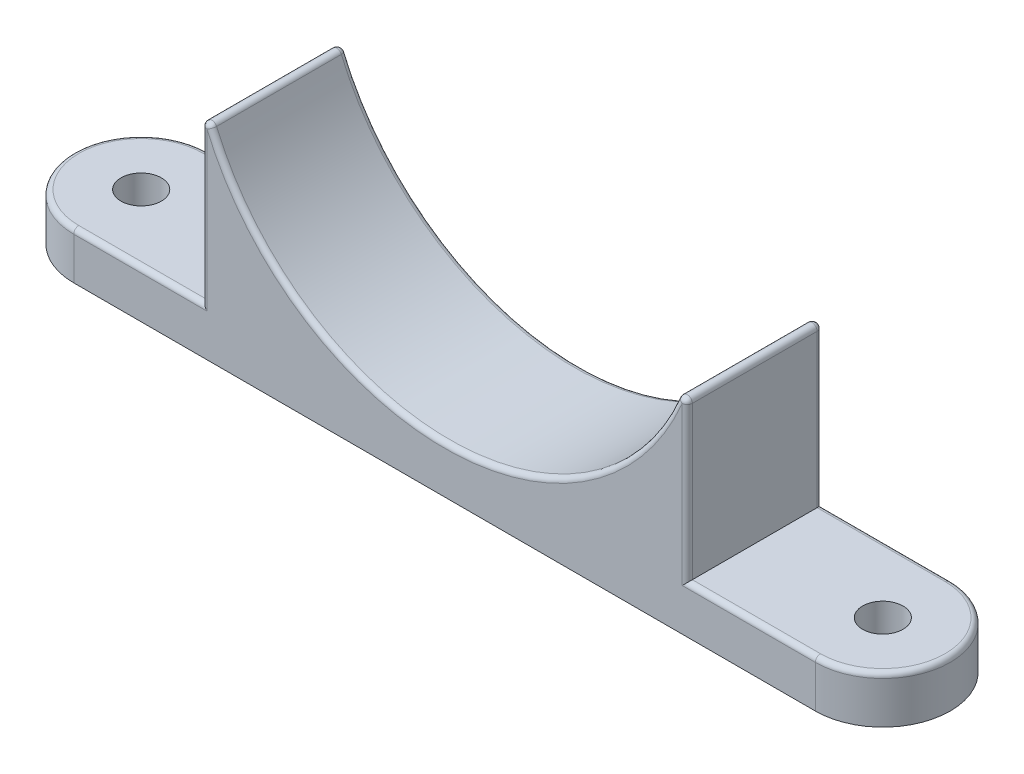
ISO-10303-21;
HEADER;
FILE_DESCRIPTION(('STEP AP214'),'2;1');
FILE_NAME('part.step','',(''),(''),'','','');
FILE_SCHEMA(('AUTOMOTIVE_DESIGN { 1 0 10303 214 1 1 1 1 }'));
ENDSEC;
DATA;
#1=APPLICATION_CONTEXT('core data for automotive mechanical design processes');
#2=APPLICATION_PROTOCOL_DEFINITION('international standard','automotive_design',2000,#1);
#3=PRODUCT_CONTEXT('',#1,'mechanical');
#4=PRODUCT('Part','Part','',(#3));
#5=PRODUCT_RELATED_PRODUCT_CATEGORY('part','',(#4));
#6=PRODUCT_DEFINITION_FORMATION('','',#4);
#7=PRODUCT_DEFINITION_CONTEXT('part definition',#1,'design');
#8=PRODUCT_DEFINITION('design','',#6,#7);
#9=PRODUCT_DEFINITION_SHAPE('','',#8);
#10=(LENGTH_UNIT() NAMED_UNIT(*) SI_UNIT(.MILLI.,.METRE.));
#11=(NAMED_UNIT(*) PLANE_ANGLE_UNIT() SI_UNIT($,.RADIAN.));
#12=(NAMED_UNIT(*) SI_UNIT($,.STERADIAN.) SOLID_ANGLE_UNIT());
#13=UNCERTAINTY_MEASURE_WITH_UNIT(LENGTH_MEASURE(1.E-05),#10,'distance_accuracy_value','');
#14=(GEOMETRIC_REPRESENTATION_CONTEXT(3) GLOBAL_UNCERTAINTY_ASSIGNED_CONTEXT((#13)) GLOBAL_UNIT_ASSIGNED_CONTEXT((#10,
#11,#12)) REPRESENTATION_CONTEXT('',''));
#15=CARTESIAN_POINT('',(0.,0.,0.));
#16=DIRECTION('',(0.,0.,1.));
#17=DIRECTION('',(1.,0.,0.));
#18=AXIS2_PLACEMENT_3D('',#15,#16,#17);
#19=CARTESIAN_POINT('',(-55.,7.,0.));
#20=DIRECTION('',(0.,1.,0.));
#21=DIRECTION('',(0.,0.,1.));
#22=AXIS2_PLACEMENT_3D('',#19,#20,#21);
#23=PLANE('',#22);
#24=CARTESIAN_POINT('',(-55.,7.,0.));
#25=DIRECTION('',(0.,1.,0.));
#26=DIRECTION('',(0.,0.,1.));
#27=AXIS2_PLACEMENT_3D('',#24,#25,#26);
#28=CIRCLE('',#27,3.);
#29=CARTESIAN_POINT('',(-55.,7.,3.));
#30=VERTEX_POINT('',#29);
#31=EDGE_CURVE('E196',#30,#30,#28,.T.);
#32=ORIENTED_EDGE('',*,*,#31,.F.);
#33=EDGE_LOOP('',(#32));
#34=FACE_BOUND('',#33,.T.);
#35=DIRECTION('',(0.,0.,1.));
#36=VECTOR('',#35,1.);
#37=CARTESIAN_POINT('',(-36.,7.,-55.));
#38=LINE('',#37,#36);
#39=CARTESIAN_POINT('',(-36.,7.,-9.25000000000001));
#40=VERTEX_POINT('',#39);
#41=CARTESIAN_POINT('',(-36.,7.,9.24999999999999));
#42=VERTEX_POINT('',#41);
#43=EDGE_CURVE('E320',#40,#42,#38,.T.);
#44=ORIENTED_EDGE('',*,*,#43,.F.);
#45=DIRECTION('',(-1.,0.,0.));
#46=VECTOR('',#45,1.);
#47=CARTESIAN_POINT('',(-55.,7.,-9.25));
#48=LINE('',#47,#46);
#49=CARTESIAN_POINT('',(-55.,7.,-9.25));
#50=VERTEX_POINT('',#49);
#51=EDGE_CURVE('E233',#40,#50,#48,.T.);
#52=ORIENTED_EDGE('',*,*,#51,.T.);
#53=CARTESIAN_POINT('',(-55.,7.,0.));
#54=DIRECTION('',(0.,1.,0.));
#55=DIRECTION('',(0.,0.,1.));
#56=AXIS2_PLACEMENT_3D('',#53,#54,#55);
#57=CIRCLE('',#56,9.25);
#58=CARTESIAN_POINT('',(-55.,7.,9.25));
#59=VERTEX_POINT('',#58);
#60=EDGE_CURVE('E231',#50,#59,#57,.T.);
#61=ORIENTED_EDGE('',*,*,#60,.T.);
#62=DIRECTION('',(1.,0.,0.));
#63=VECTOR('',#62,1.);
#64=CARTESIAN_POINT('',(-36.,7.,9.25));
#65=LINE('',#64,#63);
#66=EDGE_CURVE('E229',#59,#42,#65,.T.);
#67=ORIENTED_EDGE('',*,*,#66,.T.);
#68=EDGE_LOOP('',(#44,#52,#61,#67));
#69=FACE_BOUND('',#68,.T.);
#70=ADVANCED_FACE('F58',(#34,#69),#23,.T.);
#71=CARTESIAN_POINT('',(55.,7.,0.));
#72=DIRECTION('',(0.,1.,0.));
#73=DIRECTION('',(0.,0.,1.));
#74=AXIS2_PLACEMENT_3D('',#71,#72,#73);
#75=CIRCLE('',#74,9.25);
#76=CARTESIAN_POINT('',(55.,7.,9.24999999999998));
#77=VERTEX_POINT('',#76);
#78=CARTESIAN_POINT('',(55.,7.,-9.25));
#79=VERTEX_POINT('',#78);
#80=EDGE_CURVE('E211',#77,#79,#75,.T.);
#81=ORIENTED_EDGE('',*,*,#80,.T.);
#82=DIRECTION('',(-1.,0.,0.));
#83=VECTOR('',#82,1.);
#84=CARTESIAN_POINT('',(36.,7.,-9.25000000000002));
#85=LINE('',#84,#83);
#86=CARTESIAN_POINT('',(36.,7.,-9.25000000000002));
#87=VERTEX_POINT('',#86);
#88=EDGE_CURVE('E213',#79,#87,#85,.T.);
#89=ORIENTED_EDGE('',*,*,#88,.T.);
#90=DIRECTION('',(0.,0.,1.));
#91=VECTOR('',#90,1.);
#92=CARTESIAN_POINT('',(36.,7.,-55.));
#93=LINE('',#92,#91);
#94=CARTESIAN_POINT('',(36.,7.,9.24999999999998));
#95=VERTEX_POINT('',#94);
#96=EDGE_CURVE('E326',#87,#95,#93,.T.);
#97=ORIENTED_EDGE('',*,*,#96,.T.);
#98=DIRECTION('',(1.,0.,0.));
#99=VECTOR('',#98,1.);
#100=CARTESIAN_POINT('',(55.,7.,9.24999999999998));
#101=LINE('',#100,#99);
#102=EDGE_CURVE('E180',#95,#77,#101,.T.);
#103=ORIENTED_EDGE('',*,*,#102,.T.);
#104=EDGE_LOOP('',(#81,#89,#97,#103));
#105=FACE_BOUND('',#104,.T.);
#106=CARTESIAN_POINT('',(55.,7.,0.));
#107=DIRECTION('',(0.,1.,0.));
#108=DIRECTION('',(0.,0.,1.));
#109=AXIS2_PLACEMENT_3D('',#106,#107,#108);
#110=CIRCLE('',#109,3.);
#111=CARTESIAN_POINT('',(55.,7.,3.));
#112=VERTEX_POINT('',#111);
#113=EDGE_CURVE('E334',#112,#112,#110,.T.);
#114=ORIENTED_EDGE('',*,*,#113,.F.);
#115=EDGE_LOOP('',(#114));
#116=FACE_BOUND('',#115,.T.);
#117=ADVANCED_FACE('F358',(#105,#116),#23,.T.);
#118=CARTESIAN_POINT('',(-55.,0.,0.));
#119=DIRECTION('',(0.,1.,0.));
#120=DIRECTION('',(0.,0.,1.));
#121=AXIS2_PLACEMENT_3D('',#118,#119,#120);
#122=PLANE('',#121);
#123=CARTESIAN_POINT('',(-55.,0.,0.));
#124=DIRECTION('',(0.,1.,0.));
#125=DIRECTION('',(0.,0.,1.));
#126=AXIS2_PLACEMENT_3D('',#123,#124,#125);
#127=CIRCLE('',#126,10.);
#128=CARTESIAN_POINT('',(-55.,0.,-10.));
#129=VERTEX_POINT('',#128);
#130=CARTESIAN_POINT('',(-55.,0.,10.));
#131=VERTEX_POINT('',#130);
#132=EDGE_CURVE('E188',#129,#131,#127,.T.);
#133=ORIENTED_EDGE('',*,*,#132,.F.);
#134=DIRECTION('',(-1.,0.,0.));
#135=VECTOR('',#134,1.);
#136=CARTESIAN_POINT('',(-55.,0.,-10.));
#137=LINE('',#136,#135);
#138=CARTESIAN_POINT('',(55.,0.,-10.));
#139=VERTEX_POINT('',#138);
#140=EDGE_CURVE('E204',#139,#129,#137,.T.);
#141=ORIENTED_EDGE('',*,*,#140,.F.);
#142=CARTESIAN_POINT('',(55.,0.,0.));
#143=DIRECTION('',(0.,1.,0.));
#144=DIRECTION('',(0.,0.,1.));
#145=AXIS2_PLACEMENT_3D('',#142,#143,#144);
#146=CIRCLE('',#145,10.);
#147=CARTESIAN_POINT('',(55.,0.,10.));
#148=VERTEX_POINT('',#147);
#149=EDGE_CURVE('E190',#148,#139,#146,.T.);
#150=ORIENTED_EDGE('',*,*,#149,.F.);
#151=DIRECTION('',(1.,0.,0.));
#152=VECTOR('',#151,1.);
#153=CARTESIAN_POINT('',(-55.,0.,10.));
#154=LINE('',#153,#152);
#155=EDGE_CURVE('E173',#131,#148,#154,.T.);
#156=ORIENTED_EDGE('',*,*,#155,.F.);
#157=EDGE_LOOP('',(#133,#141,#150,#156));
#158=FACE_BOUND('',#157,.T.);
#159=CARTESIAN_POINT('',(-55.,0.,0.));
#160=DIRECTION('',(0.,1.,0.));
#161=DIRECTION('',(0.,0.,1.));
#162=AXIS2_PLACEMENT_3D('',#159,#160,#161);
#163=CIRCLE('',#162,3.);
#164=CARTESIAN_POINT('',(-55.,0.,3.));
#165=VERTEX_POINT('',#164);
#166=EDGE_CURVE('E199',#165,#165,#163,.T.);
#167=ORIENTED_EDGE('',*,*,#166,.T.);
#168=EDGE_LOOP('',(#167));
#169=FACE_BOUND('',#168,.T.);
#170=CARTESIAN_POINT('',(55.,0.,0.));
#171=DIRECTION('',(0.,1.,0.));
#172=DIRECTION('',(0.,0.,1.));
#173=AXIS2_PLACEMENT_3D('',#170,#171,#172);
#174=CIRCLE('',#173,3.);
#175=CARTESIAN_POINT('',(55.,0.,3.));
#176=VERTEX_POINT('',#175);
#177=EDGE_CURVE('E331',#176,#176,#174,.T.);
#178=ORIENTED_EDGE('',*,*,#177,.T.);
#179=EDGE_LOOP('',(#178));
#180=FACE_BOUND('',#179,.T.);
#181=ADVANCED_FACE('F185',(#158,#169,#180),#122,.F.);
#182=CARTESIAN_POINT('',(-55.,7.,0.));
#183=DIRECTION('',(0.,-1.,0.));
#184=DIRECTION('',(0.,0.,-1.));
#185=AXIS2_PLACEMENT_3D('',#182,#183,#184);
#186=CYLINDRICAL_SURFACE('',#185,10.);
#187=DIRECTION('',(0.,-1.,0.));
#188=VECTOR('',#187,1.);
#189=CARTESIAN_POINT('',(-55.,7.,10.));
#190=LINE('',#189,#188);
#191=CARTESIAN_POINT('',(-55.,6.25,10.));
#192=VERTEX_POINT('',#191);
#193=EDGE_CURVE('E169',#192,#131,#190,.T.);
#194=ORIENTED_EDGE('',*,*,#193,.F.);
#195=CARTESIAN_POINT('',(-55.,6.25,0.));
#196=DIRECTION('',(0.,1.,0.));
#197=DIRECTION('',(0.,0.,1.));
#198=AXIS2_PLACEMENT_3D('',#195,#196,#197);
#199=CIRCLE('',#198,10.);
#200=CARTESIAN_POINT('',(-55.,6.25,-10.));
#201=VERTEX_POINT('',#200);
#202=EDGE_CURVE('E236',#192,#201,#199,.F.);
#203=ORIENTED_EDGE('',*,*,#202,.T.);
#204=DIRECTION('',(0.,-1.,0.));
#205=VECTOR('',#204,1.);
#206=CARTESIAN_POINT('',(-55.,7.,-10.));
#207=LINE('',#206,#205);
#208=EDGE_CURVE('E194',#201,#129,#207,.T.);
#209=ORIENTED_EDGE('',*,*,#208,.T.);
#210=ORIENTED_EDGE('',*,*,#132,.T.);
#211=EDGE_LOOP('',(#194,#203,#209,#210));
#212=FACE_BOUND('',#211,.T.);
#213=ADVANCED_FACE('F192',(#212),#186,.T.);
#214=CARTESIAN_POINT('',(-55.,7.,10.));
#215=DIRECTION('',(0.,0.,-1.));
#216=DIRECTION('',(-1.,0.,0.));
#217=AXIS2_PLACEMENT_3D('',#214,#215,#216);
#218=PLANE('',#217);
#219=DIRECTION('',(0.,-1.,0.));
#220=VECTOR('',#219,1.);
#221=CARTESIAN_POINT('',(55.,7.,10.));
#222=LINE('',#221,#220);
#223=CARTESIAN_POINT('',(55.,6.25,10.));
#224=VERTEX_POINT('',#223);
#225=EDGE_CURVE('E181',#224,#148,#222,.T.);
#226=ORIENTED_EDGE('',*,*,#225,.F.);
#227=DIRECTION('',(1.,0.,0.));
#228=VECTOR('',#227,1.);
#229=CARTESIAN_POINT('',(36.,6.25,9.99999999999998));
#230=LINE('',#229,#228);
#231=CARTESIAN_POINT('',(35.25,6.25,9.99999999999998));
#232=VERTEX_POINT('',#231);
#233=EDGE_CURVE('E254',#224,#232,#230,.F.);
#234=ORIENTED_EDGE('',*,*,#233,.T.);
#235=DIRECTION('',(0.,1.,0.));
#236=VECTOR('',#235,1.);
#237=CARTESIAN_POINT('',(35.25,34.,9.99999999999998));
#238=LINE('',#237,#236);
#239=CARTESIAN_POINT('',(35.25,29.6507575950825,9.99999999999998));
#240=VERTEX_POINT('',#239);
#241=EDGE_CURVE('E252',#232,#240,#238,.T.);
#242=ORIENTED_EDGE('',*,*,#241,.T.);
#243=CARTESIAN_POINT('',(0.,44.5,9.99999999999999));
#244=DIRECTION('',(0.,0.,-1.));
#245=DIRECTION('',(-1.,0.,0.));
#246=AXIS2_PLACEMENT_3D('',#243,#244,#245);
#247=CIRCLE('',#246,38.25);
#248=CARTESIAN_POINT('',(-35.25,29.6507575950825,10.));
#249=VERTEX_POINT('',#248);
#250=EDGE_CURVE('E250',#240,#249,#247,.T.);
#251=ORIENTED_EDGE('',*,*,#250,.T.);
#252=DIRECTION('',(0.,1.,0.));
#253=VECTOR('',#252,1.);
#254=CARTESIAN_POINT('',(-35.25,7.,10.));
#255=LINE('',#254,#253);
#256=CARTESIAN_POINT('',(-35.25,6.25,10.));
#257=VERTEX_POINT('',#256);
#258=EDGE_CURVE('E248',#249,#257,#255,.F.);
#259=ORIENTED_EDGE('',*,*,#258,.T.);
#260=DIRECTION('',(1.,0.,0.));
#261=VECTOR('',#260,1.);
#262=CARTESIAN_POINT('',(-55.,6.25,10.));
#263=LINE('',#262,#261);
#264=EDGE_CURVE('E176',#257,#192,#263,.F.);
#265=ORIENTED_EDGE('',*,*,#264,.T.);
#266=ORIENTED_EDGE('',*,*,#193,.T.);
#267=ORIENTED_EDGE('',*,*,#155,.T.);
#268=EDGE_LOOP('',(#226,#234,#242,#251,#259,#265,#266,#267));
#269=FACE_BOUND('',#268,.T.);
#270=ADVANCED_FACE('F172',(#269),#218,.F.);
#271=CARTESIAN_POINT('',(55.,7.,0.));
#272=DIRECTION('',(0.,-1.,0.));
#273=DIRECTION('',(0.,0.,-1.));
#274=AXIS2_PLACEMENT_3D('',#271,#272,#273);
#275=CYLINDRICAL_SURFACE('',#274,10.);
#276=DIRECTION('',(0.,-1.,0.));
#277=VECTOR('',#276,1.);
#278=CARTESIAN_POINT('',(55.,7.,-10.));
#279=LINE('',#278,#277);
#280=CARTESIAN_POINT('',(55.,6.25,-10.));
#281=VERTEX_POINT('',#280);
#282=EDGE_CURVE('E207',#281,#139,#279,.T.);
#283=ORIENTED_EDGE('',*,*,#282,.F.);
#284=CARTESIAN_POINT('',(55.,6.25,0.));
#285=DIRECTION('',(0.,1.,0.));
#286=DIRECTION('',(0.,0.,1.));
#287=AXIS2_PLACEMENT_3D('',#284,#285,#286);
#288=CIRCLE('',#287,10.);
#289=EDGE_CURVE('E227',#281,#224,#288,.F.);
#290=ORIENTED_EDGE('',*,*,#289,.T.);
#291=ORIENTED_EDGE('',*,*,#225,.T.);
#292=ORIENTED_EDGE('',*,*,#149,.T.);
#293=EDGE_LOOP('',(#283,#290,#291,#292));
#294=FACE_BOUND('',#293,.T.);
#295=ADVANCED_FACE('F372',(#294),#275,.T.);
#296=CARTESIAN_POINT('',(-55.,7.,-10.));
#297=DIRECTION('',(0.,0.,1.));
#298=DIRECTION('',(1.,0.,0.));
#299=AXIS2_PLACEMENT_3D('',#296,#297,#298);
#300=PLANE('',#299);
#301=DIRECTION('',(0.,-1.,0.));
#302=VECTOR('',#301,1.);
#303=CARTESIAN_POINT('',(35.25,7.,-10.));
#304=LINE('',#303,#302);
#305=CARTESIAN_POINT('',(35.25,29.6507575950825,-10.));
#306=VERTEX_POINT('',#305);
#307=CARTESIAN_POINT('',(35.25,6.25,-10.));
#308=VERTEX_POINT('',#307);
#309=EDGE_CURVE('E222',#306,#308,#304,.T.);
#310=ORIENTED_EDGE('',*,*,#309,.T.);
#311=DIRECTION('',(-1.,0.,0.));
#312=VECTOR('',#311,1.);
#313=CARTESIAN_POINT('',(55.,6.25,-10.));
#314=LINE('',#313,#312);
#315=EDGE_CURVE('E224',#308,#281,#314,.F.);
#316=ORIENTED_EDGE('',*,*,#315,.T.);
#317=ORIENTED_EDGE('',*,*,#282,.T.);
#318=ORIENTED_EDGE('',*,*,#140,.T.);
#319=ORIENTED_EDGE('',*,*,#208,.F.);
#320=DIRECTION('',(-1.,0.,0.));
#321=VECTOR('',#320,1.);
#322=CARTESIAN_POINT('',(-36.,6.25,-10.));
#323=LINE('',#322,#321);
#324=CARTESIAN_POINT('',(-35.25,6.25,-10.));
#325=VERTEX_POINT('',#324);
#326=EDGE_CURVE('E220',#201,#325,#323,.F.);
#327=ORIENTED_EDGE('',*,*,#326,.T.);
#328=DIRECTION('',(0.,-1.,0.));
#329=VECTOR('',#328,1.);
#330=CARTESIAN_POINT('',(-35.25,7.,-10.));
#331=LINE('',#330,#329);
#332=CARTESIAN_POINT('',(-35.25,29.6507575950825,-10.));
#333=VERTEX_POINT('',#332);
#334=EDGE_CURVE('E216',#325,#333,#331,.F.);
#335=ORIENTED_EDGE('',*,*,#334,.T.);
#336=CARTESIAN_POINT('',(0.,44.5,-10.));
#337=DIRECTION('',(0.,0.,1.));
#338=DIRECTION('',(1.,0.,0.));
#339=AXIS2_PLACEMENT_3D('',#336,#337,#338);
#340=CIRCLE('',#339,38.25);
#341=EDGE_CURVE('E218',#333,#306,#340,.T.);
#342=ORIENTED_EDGE('',*,*,#341,.T.);
#343=EDGE_LOOP('',(#310,#316,#317,#318,#319,#327,#335,#342));
#344=FACE_BOUND('',#343,.T.);
#345=ADVANCED_FACE('F353',(#344),#300,.F.);
#346=CARTESIAN_POINT('',(-55.,7.,0.));
#347=DIRECTION('',(0.,-1.,0.));
#348=DIRECTION('',(0.,0.,-1.));
#349=AXIS2_PLACEMENT_3D('',#346,#347,#348);
#350=CYLINDRICAL_SURFACE('',#349,3.);
#351=ORIENTED_EDGE('',*,*,#31,.T.);
#352=EDGE_LOOP('',(#351));
#353=FACE_BOUND('',#352,.T.);
#354=ORIENTED_EDGE('',*,*,#166,.F.);
#355=EDGE_LOOP('',(#354));
#356=FACE_BOUND('',#355,.T.);
#357=ADVANCED_FACE('F344',(#353,#356),#350,.F.);
#358=CARTESIAN_POINT('',(55.,7.,0.));
#359=DIRECTION('',(0.,-1.,0.));
#360=DIRECTION('',(0.,0.,-1.));
#361=AXIS2_PLACEMENT_3D('',#358,#359,#360);
#362=CYLINDRICAL_SURFACE('',#361,3.);
#363=ORIENTED_EDGE('',*,*,#113,.T.);
#364=EDGE_LOOP('',(#363));
#365=FACE_BOUND('',#364,.T.);
#366=ORIENTED_EDGE('',*,*,#177,.F.);
#367=EDGE_LOOP('',(#366));
#368=FACE_BOUND('',#367,.T.);
#369=ADVANCED_FACE('F341',(#365,#368),#362,.F.);
#370=CARTESIAN_POINT('',(36.,0.,-55.));
#371=DIRECTION('',(1.,0.,0.));
#372=DIRECTION('',(0.,0.,-1.));
#373=AXIS2_PLACEMENT_3D('',#370,#371,#372);
#374=PLANE('',#373);
#375=ORIENTED_EDGE('',*,*,#96,.F.);
#376=DIRECTION('',(0.,-1.,0.));
#377=VECTOR('',#376,1.);
#378=CARTESIAN_POINT('',(36.,34.,-9.25000000000002));
#379=LINE('',#378,#377);
#380=CARTESIAN_POINT('',(36.,29.6507575950825,-9.25000000000002));
#381=VERTEX_POINT('',#380);
#382=EDGE_CURVE('E12',#87,#381,#379,.F.);
#383=ORIENTED_EDGE('',*,*,#382,.T.);
#384=DIRECTION('',(0.,0.,-1.));
#385=VECTOR('',#384,1.);
#386=CARTESIAN_POINT('',(36.,29.6507575950825,9.99999999999999));
#387=LINE('',#386,#385);
#388=CARTESIAN_POINT('',(36.,29.6507575950825,9.24999999999998));
#389=VERTEX_POINT('',#388);
#390=EDGE_CURVE('E67',#381,#389,#387,.F.);
#391=ORIENTED_EDGE('',*,*,#390,.T.);
#392=DIRECTION('',(0.,1.,0.));
#393=VECTOR('',#392,1.);
#394=CARTESIAN_POINT('',(36.,7.,9.24999999999998));
#395=LINE('',#394,#393);
#396=EDGE_CURVE('E262',#389,#95,#395,.F.);
#397=ORIENTED_EDGE('',*,*,#396,.T.);
#398=EDGE_LOOP('',(#375,#383,#391,#397));
#399=FACE_BOUND('',#398,.T.);
#400=ADVANCED_FACE('F343',(#399),#374,.T.);
#401=CARTESIAN_POINT('',(0.,44.5,-55.));
#402=DIRECTION('',(0.,0.,1.));
#403=DIRECTION('',(1.,0.,0.));
#404=AXIS2_PLACEMENT_3D('',#401,#402,#403);
#405=CYLINDRICAL_SURFACE('',#404,37.5);
#406=DIRECTION('',(0.,0.,1.));
#407=VECTOR('',#406,1.);
#408=CARTESIAN_POINT('',(-34.5588235294118,29.9419192108652,-55.));
#409=LINE('',#408,#407);
#410=CARTESIAN_POINT('',(-34.5588235294118,29.9419192108652,-9.25));
#411=VERTEX_POINT('',#410);
#412=CARTESIAN_POINT('',(-34.5588235294118,29.9419192108652,9.24999999999999));
#413=VERTEX_POINT('',#412);
#414=EDGE_CURVE('E242',#411,#413,#409,.T.);
#415=ORIENTED_EDGE('',*,*,#414,.T.);
#416=CARTESIAN_POINT('',(0.,44.5,9.24999999999997));
#417=DIRECTION('',(0.,0.,-1.));
#418=DIRECTION('',(-1.,0.,0.));
#419=AXIS2_PLACEMENT_3D('',#416,#417,#418);
#420=CIRCLE('',#419,37.5);
#421=CARTESIAN_POINT('',(34.5588235294118,29.9419192108652,9.24999999999997));
#422=VERTEX_POINT('',#421);
#423=EDGE_CURVE('E244',#413,#422,#420,.F.);
#424=ORIENTED_EDGE('',*,*,#423,.T.);
#425=DIRECTION('',(0.,0.,1.));
#426=VECTOR('',#425,1.);
#427=CARTESIAN_POINT('',(34.5588235294118,29.9419192108652,-55.));
#428=LINE('',#427,#426);
#429=CARTESIAN_POINT('',(34.5588235294118,29.9419192108652,-9.25000000000002));
#430=VERTEX_POINT('',#429);
#431=EDGE_CURVE('E238',#422,#430,#428,.F.);
#432=ORIENTED_EDGE('',*,*,#431,.T.);
#433=CARTESIAN_POINT('',(0.,44.5,-9.25000000000001));
#434=DIRECTION('',(0.,0.,1.));
#435=DIRECTION('',(1.,0.,0.));
#436=AXIS2_PLACEMENT_3D('',#433,#434,#435);
#437=CIRCLE('',#436,37.5);
#438=EDGE_CURVE('E240',#430,#411,#437,.F.);
#439=ORIENTED_EDGE('',*,*,#438,.T.);
#440=EDGE_LOOP('',(#415,#424,#432,#439));
#441=FACE_BOUND('',#440,.T.);
#442=ADVANCED_FACE('F351',(#441),#405,.F.);
#443=CARTESIAN_POINT('',(-36.,0.,-55.));
#444=DIRECTION('',(1.,0.,0.));
#445=DIRECTION('',(0.,0.,-1.));
#446=AXIS2_PLACEMENT_3D('',#443,#444,#445);
#447=PLANE('',#446);
#448=DIRECTION('',(0.,0.,1.));
#449=VECTOR('',#448,1.);
#450=CARTESIAN_POINT('',(-36.,29.6507575950825,-55.));
#451=LINE('',#450,#449);
#452=CARTESIAN_POINT('',(-36.,29.6507575950825,9.24999999999999));
#453=VERTEX_POINT('',#452);
#454=CARTESIAN_POINT('',(-36.,29.6507575950825,-9.25000000000001));
#455=VERTEX_POINT('',#454);
#456=EDGE_CURVE('E258',#453,#455,#451,.F.);
#457=ORIENTED_EDGE('',*,*,#456,.T.);
#458=DIRECTION('',(0.,-1.,0.));
#459=VECTOR('',#458,1.);
#460=CARTESIAN_POINT('',(-36.,0.,-9.25000000000001));
#461=LINE('',#460,#459);
#462=EDGE_CURVE('E260',#455,#40,#461,.T.);
#463=ORIENTED_EDGE('',*,*,#462,.T.);
#464=ORIENTED_EDGE('',*,*,#43,.T.);
#465=DIRECTION('',(0.,1.,0.));
#466=VECTOR('',#465,1.);
#467=CARTESIAN_POINT('',(-36.,0.,9.24999999999999));
#468=LINE('',#467,#466);
#469=EDGE_CURVE('E256',#42,#453,#468,.T.);
#470=ORIENTED_EDGE('',*,*,#469,.T.);
#471=EDGE_LOOP('',(#457,#463,#464,#470));
#472=FACE_BOUND('',#471,.T.);
#473=ADVANCED_FACE('F448',(#472),#447,.F.);
#474=CARTESIAN_POINT('',(-55.,6.25,9.25));
#475=DIRECTION('',(-1.,0.,0.));
#476=DIRECTION('',(0.,0.,1.));
#477=AXIS2_PLACEMENT_3D('',#474,#475,#476);
#478=CYLINDRICAL_SURFACE('',#477,0.75);
#479=CARTESIAN_POINT('',(-55.,6.25,9.25));
#480=DIRECTION('',(-1.,0.,0.));
#481=DIRECTION('',(0.,0.,1.));
#482=AXIS2_PLACEMENT_3D('',#479,#480,#481);
#483=CIRCLE('',#482,0.75);
#484=EDGE_CURVE('E314',#192,#59,#483,.T.);
#485=ORIENTED_EDGE('',*,*,#484,.F.);
#486=ORIENTED_EDGE('',*,*,#264,.F.);
#487=CARTESIAN_POINT('',(-35.25,6.25,9.25));
#488=DIRECTION('',(0.707106781186547,0.707106781186547,0.));
#489=DIRECTION('',(-0.707106781186547,0.707106781186547,0.));
#490=AXIS2_PLACEMENT_3D('',#487,#488,#489);
#491=ELLIPSE('',#490,1.06066017177982,0.75);
#492=EDGE_CURVE('E62',#42,#257,#491,.T.);
#493=ORIENTED_EDGE('',*,*,#492,.F.);
#494=ORIENTED_EDGE('',*,*,#66,.F.);
#495=EDGE_LOOP('',(#485,#486,#493,#494));
#496=FACE_BOUND('',#495,.T.);
#497=ADVANCED_FACE('F60',(#496),#478,.T.);
#498=CARTESIAN_POINT('',(-35.25,0.,9.24999999999999));
#499=DIRECTION('',(0.,1.,0.));
#500=DIRECTION('',(0.,0.,1.));
#501=AXIS2_PLACEMENT_3D('',#498,#499,#500);
#502=CYLINDRICAL_SURFACE('',#501,0.75);
#503=ORIENTED_EDGE('',*,*,#492,.T.);
#504=ORIENTED_EDGE('',*,*,#258,.F.);
#505=CARTESIAN_POINT('',(-35.25,29.6507575950825,9.24999999999999));
#506=DIRECTION('',(0.,1.,0.));
#507=DIRECTION('',(0.,0.,1.));
#508=AXIS2_PLACEMENT_3D('',#505,#506,#507);
#509=CIRCLE('',#508,0.75);
#510=EDGE_CURVE('E312',#453,#249,#509,.T.);
#511=ORIENTED_EDGE('',*,*,#510,.F.);
#512=ORIENTED_EDGE('',*,*,#469,.F.);
#513=EDGE_LOOP('',(#503,#504,#511,#512));
#514=FACE_BOUND('',#513,.T.);
#515=ADVANCED_FACE('F443',(#514),#502,.T.);
#516=CARTESIAN_POINT('',(-55.,6.25,0.));
#517=DIRECTION('',(0.,1.,0.));
#518=DIRECTION('',(0.,0.,1.));
#519=AXIS2_PLACEMENT_3D('',#516,#517,#518);
#520=TOROIDAL_SURFACE('',#519,9.25,0.75);
#521=ORIENTED_EDGE('',*,*,#484,.T.);
#522=ORIENTED_EDGE('',*,*,#60,.F.);
#523=CARTESIAN_POINT('',(-55.,6.25,-9.25));
#524=DIRECTION('',(1.,0.,0.));
#525=DIRECTION('',(0.,0.,-1.));
#526=AXIS2_PLACEMENT_3D('',#523,#524,#525);
#527=CIRCLE('',#526,0.75);
#528=EDGE_CURVE('E310',#201,#50,#527,.T.);
#529=ORIENTED_EDGE('',*,*,#528,.F.);
#530=ORIENTED_EDGE('',*,*,#202,.F.);
#531=EDGE_LOOP('',(#521,#522,#529,#530));
#532=FACE_BOUND('',#531,.T.);
#533=ADVANCED_FACE('F440',(#532),#520,.T.);
#534=CARTESIAN_POINT('',(-35.25,29.6507575950825,9.25));
#535=DIRECTION('',(0.,0.,1.));
#536=DIRECTION('',(0.,-1.,0.));
#537=AXIS2_PLACEMENT_3D('',#534,#535,#536);
#538=SPHERICAL_SURFACE('',#537,0.75);
#539=CARTESIAN_POINT('',(-35.25,29.6507575950825,9.24999999999999));
#540=DIRECTION('',(0.,0.,1.));
#541=DIRECTION('',(0.,-1.,0.));
#542=AXIS2_PLACEMENT_3D('',#539,#540,#541);
#543=CIRCLE('',#542,0.75);
#544=EDGE_CURVE('E304',#453,#413,#543,.F.);
#545=ORIENTED_EDGE('',*,*,#544,.F.);
#546=ORIENTED_EDGE('',*,*,#510,.T.);
#547=CARTESIAN_POINT('',(-35.25,29.6507575950825,9.25));
#548=DIRECTION('',(-0.388215487710254,0.921568627450983,0.));
#549=DIRECTION('',(-0.921568627450983,-0.388215487710254,0.));
#550=AXIS2_PLACEMENT_3D('',#547,#548,#549);
#551=CIRCLE('',#550,0.75);
#552=EDGE_CURVE('E307',#413,#249,#551,.F.);
#553=ORIENTED_EDGE('',*,*,#552,.F.);
#554=EDGE_LOOP('',(#545,#546,#553));
#555=FACE_BOUND('',#554,.T.);
#556=ADVANCED_FACE('F436',(#555),#538,.T.);
#557=CARTESIAN_POINT('',(-55.,6.25,-9.25));
#558=DIRECTION('',(1.,0.,0.));
#559=DIRECTION('',(0.,0.,-1.));
#560=AXIS2_PLACEMENT_3D('',#557,#558,#559);
#561=CYLINDRICAL_SURFACE('',#560,0.75);
#562=ORIENTED_EDGE('',*,*,#528,.T.);
#563=ORIENTED_EDGE('',*,*,#51,.F.);
#564=CARTESIAN_POINT('',(-35.25,6.25,-9.25000000000001));
#565=DIRECTION('',(0.707106781186547,0.707106781186547,0.));
#566=DIRECTION('',(0.707106781186547,-0.707106781186547,0.));
#567=AXIS2_PLACEMENT_3D('',#564,#565,#566);
#568=ELLIPSE('',#567,1.06066017177982,0.75);
#569=EDGE_CURVE('E301',#325,#40,#568,.T.);
#570=ORIENTED_EDGE('',*,*,#569,.F.);
#571=ORIENTED_EDGE('',*,*,#326,.F.);
#572=EDGE_LOOP('',(#562,#563,#570,#571));
#573=FACE_BOUND('',#572,.T.);
#574=ADVANCED_FACE('F432',(#573),#561,.T.);
#575=CARTESIAN_POINT('',(0.,44.5,9.24999999999998));
#576=DIRECTION('',(0.,0.,-1.));
#577=DIRECTION('',(-1.,0.,0.));
#578=AXIS2_PLACEMENT_3D('',#575,#576,#577);
#579=TOROIDAL_SURFACE('',#578,38.25,0.75);
#580=ORIENTED_EDGE('',*,*,#552,.T.);
#581=ORIENTED_EDGE('',*,*,#250,.F.);
#582=CARTESIAN_POINT('',(35.25,29.6507575950825,9.24999999999997));
#583=DIRECTION('',(0.388215487710262,0.92156862745098,0.));
#584=DIRECTION('',(-0.92156862745098,0.388215487710262,0.));
#585=AXIS2_PLACEMENT_3D('',#582,#583,#584);
#586=CIRCLE('',#585,0.75);
#587=EDGE_CURVE('E298',#422,#240,#586,.T.);
#588=ORIENTED_EDGE('',*,*,#587,.F.);
#589=ORIENTED_EDGE('',*,*,#423,.F.);
#590=EDGE_LOOP('',(#580,#581,#588,#589));
#591=FACE_BOUND('',#590,.T.);
#592=ADVANCED_FACE('F428',(#591),#579,.T.);
#593=CARTESIAN_POINT('',(-35.25,29.6507575950825,-55.));
#594=DIRECTION('',(0.,0.,1.));
#595=DIRECTION('',(1.,0.,0.));
#596=AXIS2_PLACEMENT_3D('',#593,#594,#595);
#597=CYLINDRICAL_SURFACE('',#596,0.75);
#598=ORIENTED_EDGE('',*,*,#544,.T.);
#599=ORIENTED_EDGE('',*,*,#414,.F.);
#600=CARTESIAN_POINT('',(-35.25,29.6507575950825,-9.25000000000001));
#601=DIRECTION('',(0.,0.,-1.));
#602=DIRECTION('',(0.,1.,0.));
#603=AXIS2_PLACEMENT_3D('',#600,#601,#602);
#604=CIRCLE('',#603,0.75);
#605=EDGE_CURVE('E295',#455,#411,#604,.T.);
#606=ORIENTED_EDGE('',*,*,#605,.F.);
#607=ORIENTED_EDGE('',*,*,#456,.F.);
#608=EDGE_LOOP('',(#598,#599,#606,#607));
#609=FACE_BOUND('',#608,.T.);
#610=ADVANCED_FACE('F424',(#609),#597,.T.);
#611=CARTESIAN_POINT('',(-35.25,0.,-9.25000000000001));
#612=DIRECTION('',(0.,-1.,0.));
#613=DIRECTION('',(0.,0.,-1.));
#614=AXIS2_PLACEMENT_3D('',#611,#612,#613);
#615=CYLINDRICAL_SURFACE('',#614,0.75);
#616=ORIENTED_EDGE('',*,*,#569,.T.);
#617=ORIENTED_EDGE('',*,*,#462,.F.);
#618=CARTESIAN_POINT('',(-35.25,29.6507575950825,-9.25000000000001));
#619=DIRECTION('',(0.,1.,0.));
#620=DIRECTION('',(-1.,0.,0.));
#621=AXIS2_PLACEMENT_3D('',#618,#619,#620);
#622=CIRCLE('',#621,0.75);
#623=EDGE_CURVE('E292',#333,#455,#622,.T.);
#624=ORIENTED_EDGE('',*,*,#623,.F.);
#625=ORIENTED_EDGE('',*,*,#334,.F.);
#626=EDGE_LOOP('',(#616,#617,#624,#625));
#627=FACE_BOUND('',#626,.T.);
#628=ADVANCED_FACE('F420',(#627),#615,.T.);
#629=CARTESIAN_POINT('',(35.25,29.6507575950825,9.24999999999998));
#630=DIRECTION('',(0.,0.,1.));
#631=DIRECTION('',(0.,-1.,0.));
#632=AXIS2_PLACEMENT_3D('',#629,#630,#631);
#633=SPHERICAL_SURFACE('',#632,0.75);
#634=CARTESIAN_POINT('',(35.25,29.6507575950825,9.24999999999998));
#635=DIRECTION('',(0.,0.,1.));
#636=DIRECTION('',(0.,-1.,0.));
#637=AXIS2_PLACEMENT_3D('',#634,#635,#636);
#638=CIRCLE('',#637,0.75);
#639=EDGE_CURVE('E287',#422,#389,#638,.F.);
#640=ORIENTED_EDGE('',*,*,#639,.F.);
#641=ORIENTED_EDGE('',*,*,#587,.T.);
#642=CARTESIAN_POINT('',(35.25,29.6507575950825,9.24999999999998));
#643=DIRECTION('',(0.,1.,0.));
#644=DIRECTION('',(-1.,0.,0.));
#645=AXIS2_PLACEMENT_3D('',#642,#643,#644);
#646=CIRCLE('',#645,0.75);
#647=EDGE_CURVE('E289',#389,#240,#646,.F.);
#648=ORIENTED_EDGE('',*,*,#647,.F.);
#649=EDGE_LOOP('',(#640,#641,#648));
#650=FACE_BOUND('',#649,.T.);
#651=ADVANCED_FACE('F416',(#650),#633,.T.);
#652=CARTESIAN_POINT('',(-35.25,29.6507575950825,-9.25000000000001));
#653=DIRECTION('',(0.,0.,-1.));
#654=DIRECTION('',(0.,1.,0.));
#655=AXIS2_PLACEMENT_3D('',#652,#653,#654);
#656=SPHERICAL_SURFACE('',#655,0.75);
#657=ORIENTED_EDGE('',*,*,#623,.T.);
#658=ORIENTED_EDGE('',*,*,#605,.T.);
#659=CARTESIAN_POINT('',(-35.25,29.6507575950825,-9.25));
#660=DIRECTION('',(-0.388215487710262,0.92156862745098,0.));
#661=DIRECTION('',(-0.92156862745098,-0.388215487710262,0.));
#662=AXIS2_PLACEMENT_3D('',#659,#660,#661);
#663=CIRCLE('',#662,0.75);
#664=EDGE_CURVE('E284',#333,#411,#663,.F.);
#665=ORIENTED_EDGE('',*,*,#664,.F.);
#666=EDGE_LOOP('',(#657,#658,#665));
#667=FACE_BOUND('',#666,.T.);
#668=ADVANCED_FACE('F412',(#667),#656,.T.);
#669=CARTESIAN_POINT('',(35.25,7.,9.24999999999998));
#670=DIRECTION('',(0.,-1.,0.));
#671=DIRECTION('',(0.,0.,-1.));
#672=AXIS2_PLACEMENT_3D('',#669,#670,#671);
#673=CYLINDRICAL_SURFACE('',#672,0.75);
#674=ORIENTED_EDGE('',*,*,#647,.T.);
#675=ORIENTED_EDGE('',*,*,#241,.F.);
#676=CARTESIAN_POINT('',(35.25,6.25,9.24999999999998));
#677=DIRECTION('',(0.707106781186547,-0.707106781186547,0.));
#678=DIRECTION('',(-0.707106781186547,-0.707106781186547,0.));
#679=AXIS2_PLACEMENT_3D('',#676,#677,#678);
#680=ELLIPSE('',#679,1.06066017177982,0.75);
#681=EDGE_CURVE('E281',#95,#232,#680,.T.);
#682=ORIENTED_EDGE('',*,*,#681,.F.);
#683=ORIENTED_EDGE('',*,*,#396,.F.);
#684=EDGE_LOOP('',(#674,#675,#682,#683));
#685=FACE_BOUND('',#684,.T.);
#686=ADVANCED_FACE('F408',(#685),#673,.T.);
#687=CARTESIAN_POINT('',(35.25,29.6507575950825,-55.));
#688=DIRECTION('',(0.,0.,1.));
#689=DIRECTION('',(1.,0.,0.));
#690=AXIS2_PLACEMENT_3D('',#687,#688,#689);
#691=CYLINDRICAL_SURFACE('',#690,0.75);
#692=ORIENTED_EDGE('',*,*,#639,.T.);
#693=ORIENTED_EDGE('',*,*,#390,.F.);
#694=CARTESIAN_POINT('',(35.25,29.6507575950825,-9.25000000000002));
#695=DIRECTION('',(0.,0.,-1.));
#696=DIRECTION('',(0.,1.,0.));
#697=AXIS2_PLACEMENT_3D('',#694,#695,#696);
#698=CIRCLE('',#697,0.75);
#699=EDGE_CURVE('E278',#430,#381,#698,.T.);
#700=ORIENTED_EDGE('',*,*,#699,.F.);
#701=ORIENTED_EDGE('',*,*,#431,.F.);
#702=EDGE_LOOP('',(#692,#693,#700,#701));
#703=FACE_BOUND('',#702,.T.);
#704=ADVANCED_FACE('F404',(#703),#691,.T.);
#705=CARTESIAN_POINT('',(0.,44.5,-9.25000000000001));
#706=DIRECTION('',(0.,0.,1.));
#707=DIRECTION('',(1.,0.,0.));
#708=AXIS2_PLACEMENT_3D('',#705,#706,#707);
#709=TOROIDAL_SURFACE('',#708,38.25,0.75);
#710=ORIENTED_EDGE('',*,*,#664,.T.);
#711=ORIENTED_EDGE('',*,*,#438,.F.);
#712=CARTESIAN_POINT('',(35.25,29.6507575950825,-9.25000000000002));
#713=DIRECTION('',(0.388215487710254,0.921568627450983,0.));
#714=DIRECTION('',(-0.921568627450983,0.388215487710254,0.));
#715=AXIS2_PLACEMENT_3D('',#712,#713,#714);
#716=CIRCLE('',#715,0.75);
#717=EDGE_CURVE('E275',#306,#430,#716,.T.);
#718=ORIENTED_EDGE('',*,*,#717,.F.);
#719=ORIENTED_EDGE('',*,*,#341,.F.);
#720=EDGE_LOOP('',(#710,#711,#718,#719));
#721=FACE_BOUND('',#720,.T.);
#722=ADVANCED_FACE('F400',(#721),#709,.T.);
#723=CARTESIAN_POINT('',(-55.,6.25,9.25));
#724=DIRECTION('',(-1.,0.,0.));
#725=DIRECTION('',(0.,0.,1.));
#726=AXIS2_PLACEMENT_3D('',#723,#724,#725);
#727=CYLINDRICAL_SURFACE('',#726,0.75);
#728=ORIENTED_EDGE('',*,*,#681,.T.);
#729=ORIENTED_EDGE('',*,*,#233,.F.);
#730=CARTESIAN_POINT('',(55.,6.25,9.24999999999998));
#731=DIRECTION('',(1.,0.,0.));
#732=DIRECTION('',(0.,0.,-1.));
#733=AXIS2_PLACEMENT_3D('',#730,#731,#732);
#734=CIRCLE('',#733,0.75);
#735=EDGE_CURVE('E272',#77,#224,#734,.T.);
#736=ORIENTED_EDGE('',*,*,#735,.F.);
#737=ORIENTED_EDGE('',*,*,#102,.F.);
#738=EDGE_LOOP('',(#728,#729,#736,#737));
#739=FACE_BOUND('',#738,.T.);
#740=ADVANCED_FACE('F396',(#739),#727,.T.);
#741=CARTESIAN_POINT('',(35.25,29.6507575950825,-9.25000000000002));
#742=DIRECTION('',(0.,0.,-1.));
#743=DIRECTION('',(0.,1.,0.));
#744=AXIS2_PLACEMENT_3D('',#741,#742,#743);
#745=SPHERICAL_SURFACE('',#744,0.75);
#746=ORIENTED_EDGE('',*,*,#717,.T.);
#747=ORIENTED_EDGE('',*,*,#699,.T.);
#748=CARTESIAN_POINT('',(35.25,29.6507575950825,-9.25000000000002));
#749=DIRECTION('',(0.,1.,0.));
#750=DIRECTION('',(0.,0.,1.));
#751=AXIS2_PLACEMENT_3D('',#748,#749,#750);
#752=CIRCLE('',#751,0.75);
#753=EDGE_CURVE('E269',#306,#381,#752,.F.);
#754=ORIENTED_EDGE('',*,*,#753,.F.);
#755=EDGE_LOOP('',(#746,#747,#754));
#756=FACE_BOUND('',#755,.T.);
#757=ADVANCED_FACE('F392',(#756),#745,.T.);
#758=CARTESIAN_POINT('',(55.,6.25,0.));
#759=DIRECTION('',(0.,1.,0.));
#760=DIRECTION('',(0.,0.,1.));
#761=AXIS2_PLACEMENT_3D('',#758,#759,#760);
#762=TOROIDAL_SURFACE('',#761,9.25,0.75);
#763=ORIENTED_EDGE('',*,*,#735,.T.);
#764=ORIENTED_EDGE('',*,*,#289,.F.);
#765=CARTESIAN_POINT('',(55.,6.25,-9.25));
#766=DIRECTION('',(-1.,0.,0.));
#767=DIRECTION('',(0.,0.,1.));
#768=AXIS2_PLACEMENT_3D('',#765,#766,#767);
#769=CIRCLE('',#768,0.75);
#770=EDGE_CURVE('E267',#79,#281,#769,.T.);
#771=ORIENTED_EDGE('',*,*,#770,.F.);
#772=ORIENTED_EDGE('',*,*,#80,.F.);
#773=EDGE_LOOP('',(#763,#764,#771,#772));
#774=FACE_BOUND('',#773,.T.);
#775=ADVANCED_FACE('F388',(#774),#762,.T.);
#776=CARTESIAN_POINT('',(35.25,7.,-9.25000000000002));
#777=DIRECTION('',(0.,1.,0.));
#778=DIRECTION('',(0.,0.,1.));
#779=AXIS2_PLACEMENT_3D('',#776,#777,#778);
#780=CYLINDRICAL_SURFACE('',#779,0.75);
#781=ORIENTED_EDGE('',*,*,#753,.T.);
#782=ORIENTED_EDGE('',*,*,#382,.F.);
#783=CARTESIAN_POINT('',(35.25,6.25,-9.25000000000002));
#784=DIRECTION('',(0.707106781186547,-0.707106781186547,0.));
#785=DIRECTION('',(0.707106781186547,0.707106781186547,0.));
#786=AXIS2_PLACEMENT_3D('',#783,#784,#785);
#787=ELLIPSE('',#786,1.06066017177982,0.75);
#788=EDGE_CURVE('E265',#308,#87,#787,.T.);
#789=ORIENTED_EDGE('',*,*,#788,.F.);
#790=ORIENTED_EDGE('',*,*,#309,.F.);
#791=EDGE_LOOP('',(#781,#782,#789,#790));
#792=FACE_BOUND('',#791,.T.);
#793=ADVANCED_FACE('F384',(#792),#780,.T.);
#794=CARTESIAN_POINT('',(-55.,6.25,-9.25));
#795=DIRECTION('',(1.,0.,0.));
#796=DIRECTION('',(0.,0.,-1.));
#797=AXIS2_PLACEMENT_3D('',#794,#795,#796);
#798=CYLINDRICAL_SURFACE('',#797,0.75);
#799=ORIENTED_EDGE('',*,*,#770,.T.);
#800=ORIENTED_EDGE('',*,*,#315,.F.);
#801=ORIENTED_EDGE('',*,*,#788,.T.);
#802=ORIENTED_EDGE('',*,*,#88,.F.);
#803=EDGE_LOOP('',(#799,#800,#801,#802));
#804=FACE_BOUND('',#803,.T.);
#805=ADVANCED_FACE('F381',(#804),#798,.T.);
#806=CLOSED_SHELL('',(#70,#117,#181,#213,#270,#295,#345,#357,#369,#400,#442,#473,#497,#515,#533,
#556,#574,#592,#610,#628,#651,#668,#686,#704,#722,#740,#757,#775,#793,#805));
#807=MANIFOLD_SOLID_BREP('B2',#806);
#808=ADVANCED_BREP_SHAPE_REPRESENTATION('',(#18,#807),#14);
#809=SHAPE_DEFINITION_REPRESENTATION(#9,#808);
ENDSEC;
END-ISO-10303-21;
